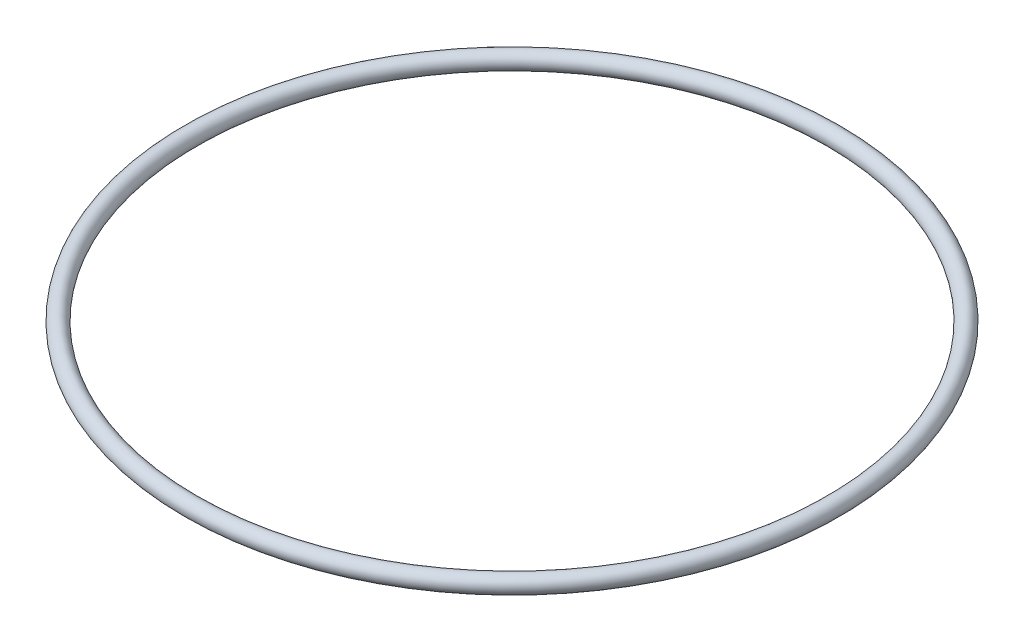
ISO-10303-21;
HEADER;
FILE_DESCRIPTION(('STEP AP214'),'2;1');
FILE_NAME('part.step','',(''),(''),'','','');
FILE_SCHEMA(('AUTOMOTIVE_DESIGN { 1 0 10303 214 1 1 1 1 }'));
ENDSEC;
DATA;
#1=APPLICATION_CONTEXT('core data for automotive mechanical design processes');
#2=APPLICATION_PROTOCOL_DEFINITION('international standard','automotive_design',2000,#1);
#3=PRODUCT_CONTEXT('',#1,'mechanical');
#4=PRODUCT('Part','Part','',(#3));
#5=PRODUCT_RELATED_PRODUCT_CATEGORY('part','',(#4));
#6=PRODUCT_DEFINITION_FORMATION('','',#4);
#7=PRODUCT_DEFINITION_CONTEXT('part definition',#1,'design');
#8=PRODUCT_DEFINITION('design','',#6,#7);
#9=PRODUCT_DEFINITION_SHAPE('','',#8);
#10=(LENGTH_UNIT() NAMED_UNIT(*) SI_UNIT(.MILLI.,.METRE.));
#11=(NAMED_UNIT(*) PLANE_ANGLE_UNIT() SI_UNIT($,.RADIAN.));
#12=(NAMED_UNIT(*) SI_UNIT($,.STERADIAN.) SOLID_ANGLE_UNIT());
#13=UNCERTAINTY_MEASURE_WITH_UNIT(LENGTH_MEASURE(1.E-05),#10,'distance_accuracy_value','');
#14=(GEOMETRIC_REPRESENTATION_CONTEXT(3) GLOBAL_UNCERTAINTY_ASSIGNED_CONTEXT((#13)) GLOBAL_UNIT_ASSIGNED_CONTEXT((#10,
#11,#12)) REPRESENTATION_CONTEXT('',''));
#15=CARTESIAN_POINT('',(0.,0.,0.));
#16=DIRECTION('',(0.,0.,1.));
#17=DIRECTION('',(1.,0.,0.));
#18=AXIS2_PLACEMENT_3D('',#15,#16,#17);
#19=CARTESIAN_POINT('',(0.,0.,0.));
#20=DIRECTION('',(0.,-1.,0.));
#21=DIRECTION('',(0.,0.,-1.));
#22=AXIS2_PLACEMENT_3D('',#19,#20,#21);
#23=TOROIDAL_SURFACE('',#22,66.65,1.765);
#24=CARTESIAN_POINT('',(0.,0.,-68.415));
#25=VERTEX_POINT('',#24);
#26=VERTEX_LOOP('',#25);
#27=FACE_BOUND('',#26,.T.);
#28=ADVANCED_FACE('F32',(#27),#23,.T.);
#29=CLOSED_SHELL('',(#28));
#30=MANIFOLD_SOLID_BREP('B2',#29);
#31=ADVANCED_BREP_SHAPE_REPRESENTATION('',(#18,#30),#14);
#32=SHAPE_DEFINITION_REPRESENTATION(#9,#31);
ENDSEC;
END-ISO-10303-21;
